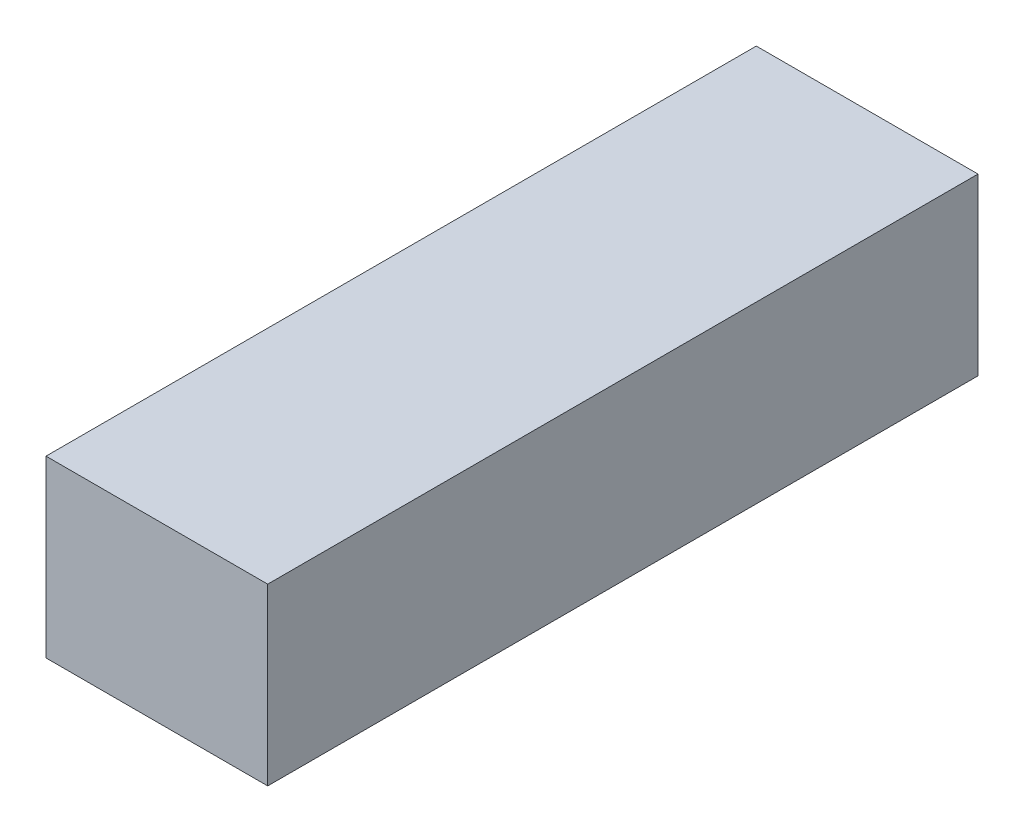
ISO-10303-21;
HEADER;
FILE_DESCRIPTION(('STEP AP214'),'2;1');
FILE_NAME('part.step','',(''),(''),'','','');
FILE_SCHEMA(('AUTOMOTIVE_DESIGN { 1 0 10303 214 1 1 1 1 }'));
ENDSEC;
DATA;
#1=APPLICATION_CONTEXT('core data for automotive mechanical design processes');
#2=APPLICATION_PROTOCOL_DEFINITION('international standard','automotive_design',2000,#1);
#3=PRODUCT_CONTEXT('',#1,'mechanical');
#4=PRODUCT('Part','Part','',(#3));
#5=PRODUCT_RELATED_PRODUCT_CATEGORY('part','',(#4));
#6=PRODUCT_DEFINITION_FORMATION('','',#4);
#7=PRODUCT_DEFINITION_CONTEXT('part definition',#1,'design');
#8=PRODUCT_DEFINITION('design','',#6,#7);
#9=PRODUCT_DEFINITION_SHAPE('','',#8);
#10=(LENGTH_UNIT() NAMED_UNIT(*) SI_UNIT(.MILLI.,.METRE.));
#11=(NAMED_UNIT(*) PLANE_ANGLE_UNIT() SI_UNIT($,.RADIAN.));
#12=(NAMED_UNIT(*) SI_UNIT($,.STERADIAN.) SOLID_ANGLE_UNIT());
#13=UNCERTAINTY_MEASURE_WITH_UNIT(LENGTH_MEASURE(1.E-05),#10,'distance_accuracy_value','');
#14=(GEOMETRIC_REPRESENTATION_CONTEXT(3) GLOBAL_UNCERTAINTY_ASSIGNED_CONTEXT((#13)) GLOBAL_UNIT_ASSIGNED_CONTEXT((#10,
#11,#12)) REPRESENTATION_CONTEXT('',''));
#15=CARTESIAN_POINT('',(0.,0.,0.));
#16=DIRECTION('',(0.,0.,1.));
#17=DIRECTION('',(1.,0.,0.));
#18=AXIS2_PLACEMENT_3D('',#15,#16,#17);
#19=CARTESIAN_POINT('',(0.,25.,0.));
#20=DIRECTION('',(1.,0.,0.));
#21=DIRECTION('',(0.,0.,-1.));
#22=AXIS2_PLACEMENT_3D('',#19,#20,#21);
#23=PLANE('',#22);
#24=DIRECTION('',(0.,0.,1.));
#25=VECTOR('',#24,1.);
#26=CARTESIAN_POINT('',(0.,0.,0.));
#27=LINE('',#26,#25);
#28=CARTESIAN_POINT('',(0.,0.,-101.6));
#29=VERTEX_POINT('',#28);
#30=CARTESIAN_POINT('',(0.,0.,0.));
#31=VERTEX_POINT('',#30);
#32=EDGE_CURVE('E98',#29,#31,#27,.T.);
#33=ORIENTED_EDGE('',*,*,#32,.T.);
#34=DIRECTION('',(0.,-1.,0.));
#35=VECTOR('',#34,1.);
#36=CARTESIAN_POINT('',(0.,25.,0.));
#37=LINE('',#36,#35);
#38=CARTESIAN_POINT('',(0.,25.,0.));
#39=VERTEX_POINT('',#38);
#40=EDGE_CURVE('E11',#39,#31,#37,.T.);
#41=ORIENTED_EDGE('',*,*,#40,.F.);
#42=DIRECTION('',(0.,0.,1.));
#43=VECTOR('',#42,1.);
#44=CARTESIAN_POINT('',(0.,25.,0.));
#45=LINE('',#44,#43);
#46=CARTESIAN_POINT('',(0.,25.,-101.6));
#47=VERTEX_POINT('',#46);
#48=EDGE_CURVE('E86',#47,#39,#45,.T.);
#49=ORIENTED_EDGE('',*,*,#48,.F.);
#50=DIRECTION('',(0.,-1.,0.));
#51=VECTOR('',#50,1.);
#52=CARTESIAN_POINT('',(0.,25.,-101.6));
#53=LINE('',#52,#51);
#54=EDGE_CURVE('E94',#47,#29,#53,.T.);
#55=ORIENTED_EDGE('',*,*,#54,.T.);
#56=EDGE_LOOP('',(#33,#41,#49,#55));
#57=FACE_BOUND('',#56,.T.);
#58=ADVANCED_FACE('F35',(#57),#23,.F.);
#59=CARTESIAN_POINT('',(0.,25.,0.));
#60=DIRECTION('',(0.,0.,-1.));
#61=DIRECTION('',(-1.,0.,0.));
#62=AXIS2_PLACEMENT_3D('',#59,#60,#61);
#63=PLANE('',#62);
#64=DIRECTION('',(1.,0.,0.));
#65=VECTOR('',#64,1.);
#66=CARTESIAN_POINT('',(0.,0.,0.));
#67=LINE('',#66,#65);
#68=CARTESIAN_POINT('',(31.7117798796217,0.,0.));
#69=VERTEX_POINT('',#68);
#70=EDGE_CURVE('E90',#31,#69,#67,.T.);
#71=ORIENTED_EDGE('',*,*,#70,.T.);
#72=DIRECTION('',(0.,-1.,0.));
#73=VECTOR('',#72,1.);
#74=CARTESIAN_POINT('',(31.7117798796217,25.,0.));
#75=LINE('',#74,#73);
#76=CARTESIAN_POINT('',(31.7117798796217,25.,0.));
#77=VERTEX_POINT('',#76);
#78=EDGE_CURVE('E43',#77,#69,#75,.T.);
#79=ORIENTED_EDGE('',*,*,#78,.F.);
#80=DIRECTION('',(1.,0.,0.));
#81=VECTOR('',#80,1.);
#82=CARTESIAN_POINT('',(0.,25.,0.));
#83=LINE('',#82,#81);
#84=EDGE_CURVE('E81',#39,#77,#83,.T.);
#85=ORIENTED_EDGE('',*,*,#84,.F.);
#86=ORIENTED_EDGE('',*,*,#40,.T.);
#87=EDGE_LOOP('',(#71,#79,#85,#86));
#88=FACE_BOUND('',#87,.T.);
#89=ADVANCED_FACE('F89',(#88),#63,.F.);
#90=CARTESIAN_POINT('',(31.7117798796217,25.,0.));
#91=DIRECTION('',(-1.,0.,0.));
#92=DIRECTION('',(0.,0.,1.));
#93=AXIS2_PLACEMENT_3D('',#90,#91,#92);
#94=PLANE('',#93);
#95=DIRECTION('',(0.,0.,-1.));
#96=VECTOR('',#95,1.);
#97=CARTESIAN_POINT('',(31.7117798796217,0.,0.));
#98=LINE('',#97,#96);
#99=CARTESIAN_POINT('',(31.7117798796217,0.,-101.6));
#100=VERTEX_POINT('',#99);
#101=EDGE_CURVE('E68',#69,#100,#98,.T.);
#102=ORIENTED_EDGE('',*,*,#101,.T.);
#103=DIRECTION('',(0.,-1.,0.));
#104=VECTOR('',#103,1.);
#105=CARTESIAN_POINT('',(31.7117798796217,25.,-101.6));
#106=LINE('',#105,#104);
#107=CARTESIAN_POINT('',(31.7117798796217,25.,-101.6));
#108=VERTEX_POINT('',#107);
#109=EDGE_CURVE('E91',#108,#100,#106,.T.);
#110=ORIENTED_EDGE('',*,*,#109,.F.);
#111=DIRECTION('',(0.,0.,-1.));
#112=VECTOR('',#111,1.);
#113=CARTESIAN_POINT('',(31.7117798796217,25.,0.));
#114=LINE('',#113,#112);
#115=EDGE_CURVE('E84',#77,#108,#114,.T.);
#116=ORIENTED_EDGE('',*,*,#115,.F.);
#117=ORIENTED_EDGE('',*,*,#78,.T.);
#118=EDGE_LOOP('',(#102,#110,#116,#117));
#119=FACE_BOUND('',#118,.T.);
#120=ADVANCED_FACE('F92',(#119),#94,.F.);
#121=CARTESIAN_POINT('',(0.,25.,-101.6));
#122=DIRECTION('',(0.,0.,1.));
#123=DIRECTION('',(1.,0.,0.));
#124=AXIS2_PLACEMENT_3D('',#121,#122,#123);
#125=PLANE('',#124);
#126=DIRECTION('',(-1.,0.,0.));
#127=VECTOR('',#126,1.);
#128=CARTESIAN_POINT('',(0.,0.,-101.6));
#129=LINE('',#128,#127);
#130=EDGE_CURVE('E74',#100,#29,#129,.T.);
#131=ORIENTED_EDGE('',*,*,#130,.T.);
#132=ORIENTED_EDGE('',*,*,#54,.F.);
#133=DIRECTION('',(-1.,0.,0.));
#134=VECTOR('',#133,1.);
#135=CARTESIAN_POINT('',(0.,25.,-101.6));
#136=LINE('',#135,#134);
#137=EDGE_CURVE('E51',#108,#47,#136,.T.);
#138=ORIENTED_EDGE('',*,*,#137,.F.);
#139=ORIENTED_EDGE('',*,*,#109,.T.);
#140=EDGE_LOOP('',(#131,#132,#138,#139));
#141=FACE_BOUND('',#140,.T.);
#142=ADVANCED_FACE('F105',(#141),#125,.F.);
#143=CARTESIAN_POINT('',(0.,25.,0.));
#144=DIRECTION('',(0.,-1.,0.));
#145=DIRECTION('',(0.,0.,-1.));
#146=AXIS2_PLACEMENT_3D('',#143,#144,#145);
#147=PLANE('',#146);
#148=ORIENTED_EDGE('',*,*,#48,.T.);
#149=ORIENTED_EDGE('',*,*,#84,.T.);
#150=ORIENTED_EDGE('',*,*,#115,.T.);
#151=ORIENTED_EDGE('',*,*,#137,.T.);
#152=EDGE_LOOP('',(#148,#149,#150,#151));
#153=FACE_BOUND('',#152,.T.);
#154=ADVANCED_FACE('F82',(#153),#147,.F.);
#155=CARTESIAN_POINT('',(0.,0.,0.));
#156=DIRECTION('',(0.,-1.,0.));
#157=DIRECTION('',(0.,0.,-1.));
#158=AXIS2_PLACEMENT_3D('',#155,#156,#157);
#159=PLANE('',#158);
#160=ORIENTED_EDGE('',*,*,#32,.F.);
#161=ORIENTED_EDGE('',*,*,#130,.F.);
#162=ORIENTED_EDGE('',*,*,#101,.F.);
#163=ORIENTED_EDGE('',*,*,#70,.F.);
#164=EDGE_LOOP('',(#160,#161,#162,#163));
#165=FACE_BOUND('',#164,.T.);
#166=ADVANCED_FACE('F108',(#165),#159,.T.);
#167=CLOSED_SHELL('',(#58,#89,#120,#142,#154,#166));
#168=MANIFOLD_SOLID_BREP('B2',#167);
#169=ADVANCED_BREP_SHAPE_REPRESENTATION('',(#18,#168),#14);
#170=SHAPE_DEFINITION_REPRESENTATION(#9,#169);
ENDSEC;
END-ISO-10303-21;
